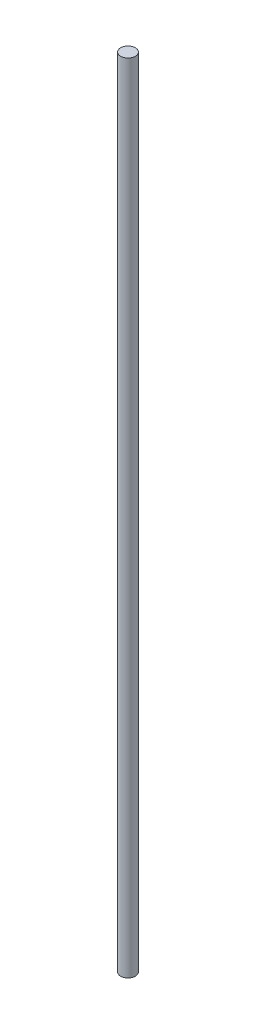
ISO-10303-21;
HEADER;
FILE_DESCRIPTION(('STEP AP214'),'2;1');
FILE_NAME('part.step','',(''),(''),'','','');
FILE_SCHEMA(('AUTOMOTIVE_DESIGN { 1 0 10303 214 1 1 1 1 }'));
ENDSEC;
DATA;
#1=APPLICATION_CONTEXT('core data for automotive mechanical design processes');
#2=APPLICATION_PROTOCOL_DEFINITION('international standard','automotive_design',2000,#1);
#3=PRODUCT_CONTEXT('',#1,'mechanical');
#4=PRODUCT('Part','Part','',(#3));
#5=PRODUCT_RELATED_PRODUCT_CATEGORY('part','',(#4));
#6=PRODUCT_DEFINITION_FORMATION('','',#4);
#7=PRODUCT_DEFINITION_CONTEXT('part definition',#1,'design');
#8=PRODUCT_DEFINITION('design','',#6,#7);
#9=PRODUCT_DEFINITION_SHAPE('','',#8);
#10=(LENGTH_UNIT() NAMED_UNIT(*) SI_UNIT(.MILLI.,.METRE.));
#11=(NAMED_UNIT(*) PLANE_ANGLE_UNIT() SI_UNIT($,.RADIAN.));
#12=(NAMED_UNIT(*) SI_UNIT($,.STERADIAN.) SOLID_ANGLE_UNIT());
#13=UNCERTAINTY_MEASURE_WITH_UNIT(LENGTH_MEASURE(1.E-05),#10,'distance_accuracy_value','');
#14=(GEOMETRIC_REPRESENTATION_CONTEXT(3) GLOBAL_UNCERTAINTY_ASSIGNED_CONTEXT((#13)) GLOBAL_UNIT_ASSIGNED_CONTEXT((#10,
#11,#12)) REPRESENTATION_CONTEXT('',''));
#15=CARTESIAN_POINT('',(0.,0.,0.));
#16=DIRECTION('',(0.,0.,1.));
#17=DIRECTION('',(1.,0.,0.));
#18=AXIS2_PLACEMENT_3D('',#15,#16,#17);
#19=CARTESIAN_POINT('',(0.,432.,0.));
#20=DIRECTION('',(0.,-1.,0.));
#21=DIRECTION('',(0.,0.,-1.));
#22=AXIS2_PLACEMENT_3D('',#19,#20,#21);
#23=CYLINDRICAL_SURFACE('',#22,4.);
#24=CARTESIAN_POINT('',(0.,432.,0.));
#25=DIRECTION('',(0.,1.,0.));
#26=DIRECTION('',(0.,0.,1.));
#27=AXIS2_PLACEMENT_3D('',#24,#25,#26);
#28=CIRCLE('',#27,4.);
#29=CARTESIAN_POINT('',(0.,432.,4.));
#30=VERTEX_POINT('',#29);
#31=EDGE_CURVE('E10',#30,#30,#28,.T.);
#32=ORIENTED_EDGE('',*,*,#31,.F.);
#33=EDGE_LOOP('',(#32));
#34=FACE_BOUND('',#33,.T.);
#35=CARTESIAN_POINT('',(0.,0.,0.));
#36=DIRECTION('',(0.,1.,0.));
#37=DIRECTION('',(0.,0.,1.));
#38=AXIS2_PLACEMENT_3D('',#35,#36,#37);
#39=CIRCLE('',#38,4.);
#40=CARTESIAN_POINT('',(0.,0.,4.));
#41=VERTEX_POINT('',#40);
#42=EDGE_CURVE('E40',#41,#41,#39,.T.);
#43=ORIENTED_EDGE('',*,*,#42,.T.);
#44=EDGE_LOOP('',(#43));
#45=FACE_BOUND('',#44,.T.);
#46=ADVANCED_FACE('F37',(#34,#45),#23,.T.);
#47=CARTESIAN_POINT('',(0.,432.,0.));
#48=DIRECTION('',(0.,1.,0.));
#49=DIRECTION('',(0.,0.,1.));
#50=AXIS2_PLACEMENT_3D('',#47,#48,#49);
#51=PLANE('',#50);
#52=ORIENTED_EDGE('',*,*,#31,.T.);
#53=EDGE_LOOP('',(#52));
#54=FACE_BOUND('',#53,.T.);
#55=ADVANCED_FACE('F52',(#54),#51,.T.);
#56=CARTESIAN_POINT('',(0.,0.,0.));
#57=DIRECTION('',(0.,1.,0.));
#58=DIRECTION('',(0.,0.,1.));
#59=AXIS2_PLACEMENT_3D('',#56,#57,#58);
#60=PLANE('',#59);
#61=ORIENTED_EDGE('',*,*,#42,.F.);
#62=EDGE_LOOP('',(#61));
#63=FACE_BOUND('',#62,.T.);
#64=ADVANCED_FACE('F50',(#63),#60,.F.);
#65=CLOSED_SHELL('',(#46,#55,#64));
#66=MANIFOLD_SOLID_BREP('B2',#65);
#67=ADVANCED_BREP_SHAPE_REPRESENTATION('',(#18,#66),#14);
#68=SHAPE_DEFINITION_REPRESENTATION(#9,#67);
ENDSEC;
END-ISO-10303-21;
